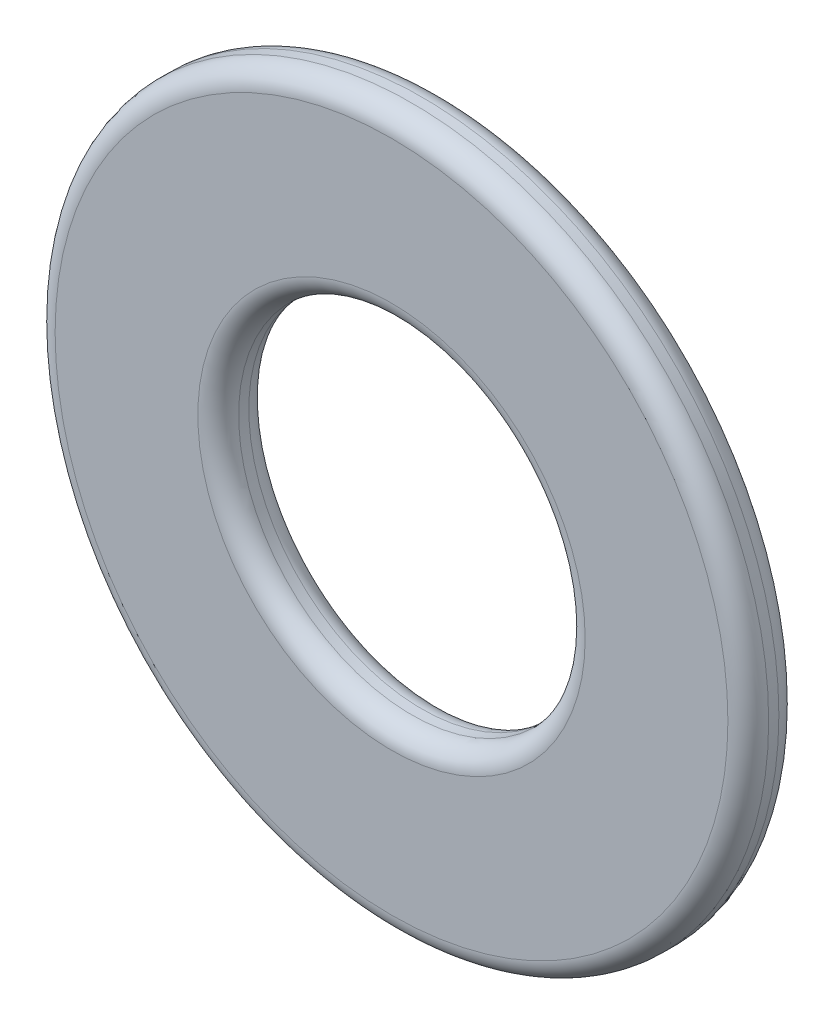
ISO-10303-21;
HEADER;
FILE_DESCRIPTION(('STEP AP214'),'2;1');
FILE_NAME('part.step','',(''),(''),'','','');
FILE_SCHEMA(('AUTOMOTIVE_DESIGN { 1 0 10303 214 1 1 1 1 }'));
ENDSEC;
DATA;
#1=APPLICATION_CONTEXT('core data for automotive mechanical design processes');
#2=APPLICATION_PROTOCOL_DEFINITION('international standard','automotive_design',2000,#1);
#3=PRODUCT_CONTEXT('',#1,'mechanical');
#4=PRODUCT('Part','Part','',(#3));
#5=PRODUCT_RELATED_PRODUCT_CATEGORY('part','',(#4));
#6=PRODUCT_DEFINITION_FORMATION('','',#4);
#7=PRODUCT_DEFINITION_CONTEXT('part definition',#1,'design');
#8=PRODUCT_DEFINITION('design','',#6,#7);
#9=PRODUCT_DEFINITION_SHAPE('','',#8);
#10=(LENGTH_UNIT() NAMED_UNIT(*) SI_UNIT(.MILLI.,.METRE.));
#11=(NAMED_UNIT(*) PLANE_ANGLE_UNIT() SI_UNIT($,.RADIAN.));
#12=(NAMED_UNIT(*) SI_UNIT($,.STERADIAN.) SOLID_ANGLE_UNIT());
#13=UNCERTAINTY_MEASURE_WITH_UNIT(LENGTH_MEASURE(1.E-05),#10,'distance_accuracy_value','');
#14=(GEOMETRIC_REPRESENTATION_CONTEXT(3) GLOBAL_UNCERTAINTY_ASSIGNED_CONTEXT((#13)) GLOBAL_UNIT_ASSIGNED_CONTEXT((#10,
#11,#12)) REPRESENTATION_CONTEXT('',''));
#15=CARTESIAN_POINT('',(0.,0.,0.));
#16=DIRECTION('',(0.,0.,1.));
#17=DIRECTION('',(1.,0.,0.));
#18=AXIS2_PLACEMENT_3D('',#15,#16,#17);
#19=CARTESIAN_POINT('',(0.,0.,0.5));
#20=DIRECTION('',(0.,0.,1.));
#21=DIRECTION('',(1.,0.,0.));
#22=AXIS2_PLACEMENT_3D('',#19,#20,#21);
#23=PLANE('',#22);
#24=CARTESIAN_POINT('',(0.,0.,0.5));
#25=DIRECTION('',(0.,0.,1.));
#26=DIRECTION('',(1.,0.,0.));
#27=AXIS2_PLACEMENT_3D('',#24,#25,#26);
#28=CIRCLE('',#27,1.9);
#29=CARTESIAN_POINT('',(1.9,0.,0.5));
#30=VERTEX_POINT('',#29);
#31=EDGE_CURVE('E10',#30,#30,#28,.F.);
#32=ORIENTED_EDGE('',*,*,#31,.T.);
#33=EDGE_LOOP('',(#32));
#34=FACE_BOUND('',#33,.T.);
#35=CARTESIAN_POINT('',(0.,0.,0.5));
#36=DIRECTION('',(0.,0.,1.));
#37=DIRECTION('',(1.,0.,0.));
#38=AXIS2_PLACEMENT_3D('',#35,#36,#37);
#39=CIRCLE('',#38,3.3);
#40=CARTESIAN_POINT('',(3.3,0.,0.5));
#41=VERTEX_POINT('',#40);
#42=EDGE_CURVE('E49',#41,#41,#39,.T.);
#43=ORIENTED_EDGE('',*,*,#42,.T.);
#44=EDGE_LOOP('',(#43));
#45=FACE_BOUND('',#44,.T.);
#46=ADVANCED_FACE('F41',(#34,#45),#23,.T.);
#47=CARTESIAN_POINT('',(0.,0.,0.));
#48=DIRECTION('',(0.,0.,1.));
#49=DIRECTION('',(1.,0.,0.));
#50=AXIS2_PLACEMENT_3D('',#47,#48,#49);
#51=PLANE('',#50);
#52=CARTESIAN_POINT('',(0.,0.,0.));
#53=DIRECTION('',(0.,0.,1.));
#54=DIRECTION('',(1.,0.,0.));
#55=AXIS2_PLACEMENT_3D('',#52,#53,#54);
#56=CIRCLE('',#55,1.9);
#57=CARTESIAN_POINT('',(1.9,0.,0.));
#58=VERTEX_POINT('',#57);
#59=EDGE_CURVE('E73',#58,#58,#56,.T.);
#60=ORIENTED_EDGE('',*,*,#59,.T.);
#61=EDGE_LOOP('',(#60));
#62=FACE_BOUND('',#61,.T.);
#63=CARTESIAN_POINT('',(0.,0.,0.));
#64=DIRECTION('',(0.,0.,1.));
#65=DIRECTION('',(1.,0.,0.));
#66=AXIS2_PLACEMENT_3D('',#63,#64,#65);
#67=CIRCLE('',#66,3.3);
#68=CARTESIAN_POINT('',(3.3,0.,0.));
#69=VERTEX_POINT('',#68);
#70=EDGE_CURVE('E77',#69,#69,#67,.F.);
#71=ORIENTED_EDGE('',*,*,#70,.T.);
#72=EDGE_LOOP('',(#71));
#73=FACE_BOUND('',#72,.T.);
#74=ADVANCED_FACE('F82',(#62,#73),#51,.F.);
#75=CARTESIAN_POINT('',(0.,0.,0.5));
#76=DIRECTION('',(0.,0.,-1.));
#77=DIRECTION('',(-1.,0.,0.));
#78=AXIS2_PLACEMENT_3D('',#75,#76,#77);
#79=CYLINDRICAL_SURFACE('',#78,3.5);
#80=CARTESIAN_POINT('',(0.,0.,0.2));
#81=DIRECTION('',(0.,0.,1.));
#82=DIRECTION('',(1.,0.,0.));
#83=AXIS2_PLACEMENT_3D('',#80,#81,#82);
#84=CIRCLE('',#83,3.5);
#85=CARTESIAN_POINT('',(3.5,0.,0.2));
#86=VERTEX_POINT('',#85);
#87=EDGE_CURVE('E54',#86,#86,#84,.T.);
#88=ORIENTED_EDGE('',*,*,#87,.T.);
#89=EDGE_LOOP('',(#88));
#90=FACE_BOUND('',#89,.T.);
#91=CARTESIAN_POINT('',(0.,0.,0.3));
#92=DIRECTION('',(0.,0.,1.));
#93=DIRECTION('',(1.,0.,0.));
#94=AXIS2_PLACEMENT_3D('',#91,#92,#93);
#95=CIRCLE('',#94,3.5);
#96=CARTESIAN_POINT('',(3.5,0.,0.3));
#97=VERTEX_POINT('',#96);
#98=EDGE_CURVE('E59',#97,#97,#95,.F.);
#99=ORIENTED_EDGE('',*,*,#98,.T.);
#100=EDGE_LOOP('',(#99));
#101=FACE_BOUND('',#100,.T.);
#102=ADVANCED_FACE('F92',(#90,#101),#79,.T.);
#103=CARTESIAN_POINT('',(0.,0.,0.5));
#104=DIRECTION('',(0.,0.,-1.));
#105=DIRECTION('',(-1.,0.,0.));
#106=AXIS2_PLACEMENT_3D('',#103,#104,#105);
#107=CYLINDRICAL_SURFACE('',#106,1.7);
#108=CARTESIAN_POINT('',(0.,0.,0.2));
#109=DIRECTION('',(0.,0.,1.));
#110=DIRECTION('',(1.,0.,0.));
#111=AXIS2_PLACEMENT_3D('',#108,#109,#110);
#112=CIRCLE('',#111,1.7);
#113=CARTESIAN_POINT('',(1.7,0.,0.2));
#114=VERTEX_POINT('',#113);
#115=EDGE_CURVE('E65',#114,#114,#112,.F.);
#116=ORIENTED_EDGE('',*,*,#115,.T.);
#117=EDGE_LOOP('',(#116));
#118=FACE_BOUND('',#117,.T.);
#119=CARTESIAN_POINT('',(0.,0.,0.3));
#120=DIRECTION('',(0.,0.,1.));
#121=DIRECTION('',(1.,0.,0.));
#122=AXIS2_PLACEMENT_3D('',#119,#120,#121);
#123=CIRCLE('',#122,1.7);
#124=CARTESIAN_POINT('',(1.7,0.,0.3));
#125=VERTEX_POINT('',#124);
#126=EDGE_CURVE('E69',#125,#125,#123,.T.);
#127=ORIENTED_EDGE('',*,*,#126,.T.);
#128=EDGE_LOOP('',(#127));
#129=FACE_BOUND('',#128,.T.);
#130=ADVANCED_FACE('F95',(#118,#129),#107,.F.);
#131=CARTESIAN_POINT('',(0.,0.,0.2));
#132=DIRECTION('',(0.,0.,1.));
#133=DIRECTION('',(1.,0.,0.));
#134=AXIS2_PLACEMENT_3D('',#131,#132,#133);
#135=TOROIDAL_SURFACE('',#134,1.9,0.2);
#136=ORIENTED_EDGE('',*,*,#115,.F.);
#137=EDGE_LOOP('',(#136));
#138=FACE_BOUND('',#137,.T.);
#139=ORIENTED_EDGE('',*,*,#59,.F.);
#140=EDGE_LOOP('',(#139));
#141=FACE_BOUND('',#140,.T.);
#142=ADVANCED_FACE('F88',(#138,#141),#135,.T.);
#143=CARTESIAN_POINT('',(0.,0.,0.2));
#144=DIRECTION('',(0.,0.,1.));
#145=DIRECTION('',(1.,0.,0.));
#146=AXIS2_PLACEMENT_3D('',#143,#144,#145);
#147=TOROIDAL_SURFACE('',#146,3.3,0.2);
#148=ORIENTED_EDGE('',*,*,#70,.F.);
#149=EDGE_LOOP('',(#148));
#150=FACE_BOUND('',#149,.T.);
#151=ORIENTED_EDGE('',*,*,#87,.F.);
#152=EDGE_LOOP('',(#151));
#153=FACE_BOUND('',#152,.T.);
#154=ADVANCED_FACE('F84',(#150,#153),#147,.T.);
#155=CARTESIAN_POINT('',(0.,0.,0.3));
#156=DIRECTION('',(0.,0.,1.));
#157=DIRECTION('',(1.,0.,0.));
#158=AXIS2_PLACEMENT_3D('',#155,#156,#157);
#159=TOROIDAL_SURFACE('',#158,1.9,0.2);
#160=ORIENTED_EDGE('',*,*,#31,.F.);
#161=EDGE_LOOP('',(#160));
#162=FACE_BOUND('',#161,.T.);
#163=ORIENTED_EDGE('',*,*,#126,.F.);
#164=EDGE_LOOP('',(#163));
#165=FACE_BOUND('',#164,.T.);
#166=ADVANCED_FACE('F87',(#162,#165),#159,.T.);
#167=CARTESIAN_POINT('',(0.,0.,0.3));
#168=DIRECTION('',(0.,0.,1.));
#169=DIRECTION('',(1.,0.,0.));
#170=AXIS2_PLACEMENT_3D('',#167,#168,#169);
#171=TOROIDAL_SURFACE('',#170,3.3,0.2);
#172=ORIENTED_EDGE('',*,*,#98,.F.);
#173=EDGE_LOOP('',(#172));
#174=FACE_BOUND('',#173,.T.);
#175=ORIENTED_EDGE('',*,*,#42,.F.);
#176=EDGE_LOOP('',(#175));
#177=FACE_BOUND('',#176,.T.);
#178=ADVANCED_FACE('F43',(#174,#177),#171,.T.);
#179=CLOSED_SHELL('',(#46,#74,#102,#130,#142,#154,#166,#178));
#180=MANIFOLD_SOLID_BREP('B2',#179);
#181=ADVANCED_BREP_SHAPE_REPRESENTATION('',(#18,#180),#14);
#182=SHAPE_DEFINITION_REPRESENTATION(#9,#181);
ENDSEC;
END-ISO-10303-21;
